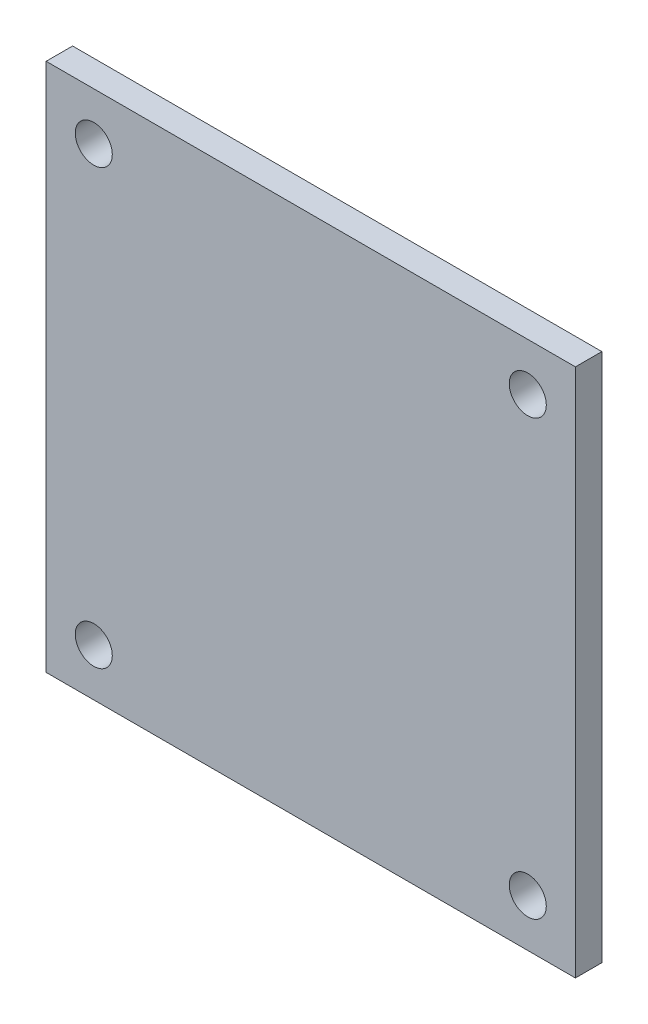
ISO-10303-21;
HEADER;
FILE_DESCRIPTION(('STEP AP214'),'2;1');
FILE_NAME('part.step','',(''),(''),'','','');
FILE_SCHEMA(('AUTOMOTIVE_DESIGN { 1 0 10303 214 1 1 1 1 }'));
ENDSEC;
DATA;
#1=APPLICATION_CONTEXT('core data for automotive mechanical design processes');
#2=APPLICATION_PROTOCOL_DEFINITION('international standard','automotive_design',2000,#1);
#3=PRODUCT_CONTEXT('',#1,'mechanical');
#4=PRODUCT('Part','Part','',(#3));
#5=PRODUCT_RELATED_PRODUCT_CATEGORY('part','',(#4));
#6=PRODUCT_DEFINITION_FORMATION('','',#4);
#7=PRODUCT_DEFINITION_CONTEXT('part definition',#1,'design');
#8=PRODUCT_DEFINITION('design','',#6,#7);
#9=PRODUCT_DEFINITION_SHAPE('','',#8);
#10=(LENGTH_UNIT() NAMED_UNIT(*) SI_UNIT(.MILLI.,.METRE.));
#11=(NAMED_UNIT(*) PLANE_ANGLE_UNIT() SI_UNIT($,.RADIAN.));
#12=(NAMED_UNIT(*) SI_UNIT($,.STERADIAN.) SOLID_ANGLE_UNIT());
#13=UNCERTAINTY_MEASURE_WITH_UNIT(LENGTH_MEASURE(1.E-05),#10,'distance_accuracy_value','');
#14=(GEOMETRIC_REPRESENTATION_CONTEXT(3) GLOBAL_UNCERTAINTY_ASSIGNED_CONTEXT((#13)) GLOBAL_UNIT_ASSIGNED_CONTEXT((#10,
#11,#12)) REPRESENTATION_CONTEXT('',''));
#15=CARTESIAN_POINT('',(0.,0.,0.));
#16=DIRECTION('',(0.,0.,1.));
#17=DIRECTION('',(1.,0.,0.));
#18=AXIS2_PLACEMENT_3D('',#15,#16,#17);
#19=CARTESIAN_POINT('',(50.,-50.,5.));
#20=DIRECTION('',(-1.,0.,0.));
#21=DIRECTION('',(0.,0.,1.));
#22=AXIS2_PLACEMENT_3D('',#19,#20,#21);
#23=PLANE('',#22);
#24=DIRECTION('',(0.,1.,0.));
#25=VECTOR('',#24,1.);
#26=CARTESIAN_POINT('',(50.,-50.,0.));
#27=LINE('',#26,#25);
#28=CARTESIAN_POINT('',(50.,-50.,0.));
#29=VERTEX_POINT('',#28);
#30=CARTESIAN_POINT('',(50.,50.,0.));
#31=VERTEX_POINT('',#30);
#32=EDGE_CURVE('E102',#29,#31,#27,.T.);
#33=ORIENTED_EDGE('',*,*,#32,.T.);
#34=DIRECTION('',(0.,0.,-1.));
#35=VECTOR('',#34,1.);
#36=CARTESIAN_POINT('',(50.,50.,5.));
#37=LINE('',#36,#35);
#38=CARTESIAN_POINT('',(50.,50.,5.));
#39=VERTEX_POINT('',#38);
#40=EDGE_CURVE('E11',#39,#31,#37,.T.);
#41=ORIENTED_EDGE('',*,*,#40,.F.);
#42=DIRECTION('',(0.,1.,0.));
#43=VECTOR('',#42,1.);
#44=CARTESIAN_POINT('',(50.,-50.,5.));
#45=LINE('',#44,#43);
#46=CARTESIAN_POINT('',(50.,-50.,5.));
#47=VERTEX_POINT('',#46);
#48=EDGE_CURVE('E90',#47,#39,#45,.T.);
#49=ORIENTED_EDGE('',*,*,#48,.F.);
#50=DIRECTION('',(0.,0.,-1.));
#51=VECTOR('',#50,1.);
#52=CARTESIAN_POINT('',(50.,-50.,5.));
#53=LINE('',#52,#51);
#54=EDGE_CURVE('E98',#47,#29,#53,.T.);
#55=ORIENTED_EDGE('',*,*,#54,.T.);
#56=EDGE_LOOP('',(#33,#41,#49,#55));
#57=FACE_BOUND('',#56,.T.);
#58=ADVANCED_FACE('F39',(#57),#23,.F.);
#59=CARTESIAN_POINT('',(-50.,50.,5.));
#60=DIRECTION('',(0.,-1.,0.));
#61=DIRECTION('',(0.,0.,-1.));
#62=AXIS2_PLACEMENT_3D('',#59,#60,#61);
#63=PLANE('',#62);
#64=DIRECTION('',(-1.,0.,0.));
#65=VECTOR('',#64,1.);
#66=CARTESIAN_POINT('',(-50.,50.,0.));
#67=LINE('',#66,#65);
#68=CARTESIAN_POINT('',(-50.,50.,0.));
#69=VERTEX_POINT('',#68);
#70=EDGE_CURVE('E94',#31,#69,#67,.T.);
#71=ORIENTED_EDGE('',*,*,#70,.T.);
#72=DIRECTION('',(0.,0.,-1.));
#73=VECTOR('',#72,1.);
#74=CARTESIAN_POINT('',(-50.,50.,5.));
#75=LINE('',#74,#73);
#76=CARTESIAN_POINT('',(-50.,50.,5.));
#77=VERTEX_POINT('',#76);
#78=EDGE_CURVE('E47',#77,#69,#75,.T.);
#79=ORIENTED_EDGE('',*,*,#78,.F.);
#80=DIRECTION('',(-1.,0.,0.));
#81=VECTOR('',#80,1.);
#82=CARTESIAN_POINT('',(-50.,50.,5.));
#83=LINE('',#82,#81);
#84=EDGE_CURVE('E85',#39,#77,#83,.T.);
#85=ORIENTED_EDGE('',*,*,#84,.F.);
#86=ORIENTED_EDGE('',*,*,#40,.T.);
#87=EDGE_LOOP('',(#71,#79,#85,#86));
#88=FACE_BOUND('',#87,.T.);
#89=ADVANCED_FACE('F93',(#88),#63,.F.);
#90=CARTESIAN_POINT('',(-50.,-50.,5.));
#91=DIRECTION('',(1.,0.,0.));
#92=DIRECTION('',(0.,0.,-1.));
#93=AXIS2_PLACEMENT_3D('',#90,#91,#92);
#94=PLANE('',#93);
#95=DIRECTION('',(0.,-1.,0.));
#96=VECTOR('',#95,1.);
#97=CARTESIAN_POINT('',(-50.,-50.,0.));
#98=LINE('',#97,#96);
#99=CARTESIAN_POINT('',(-50.,-50.,0.));
#100=VERTEX_POINT('',#99);
#101=EDGE_CURVE('E72',#69,#100,#98,.T.);
#102=ORIENTED_EDGE('',*,*,#101,.T.);
#103=DIRECTION('',(0.,0.,-1.));
#104=VECTOR('',#103,1.);
#105=CARTESIAN_POINT('',(-50.,-50.,5.));
#106=LINE('',#105,#104);
#107=CARTESIAN_POINT('',(-50.,-50.,5.));
#108=VERTEX_POINT('',#107);
#109=EDGE_CURVE('E95',#108,#100,#106,.T.);
#110=ORIENTED_EDGE('',*,*,#109,.F.);
#111=DIRECTION('',(0.,-1.,0.));
#112=VECTOR('',#111,1.);
#113=CARTESIAN_POINT('',(-50.,-50.,5.));
#114=LINE('',#113,#112);
#115=EDGE_CURVE('E88',#77,#108,#114,.T.);
#116=ORIENTED_EDGE('',*,*,#115,.F.);
#117=ORIENTED_EDGE('',*,*,#78,.T.);
#118=EDGE_LOOP('',(#102,#110,#116,#117));
#119=FACE_BOUND('',#118,.T.);
#120=ADVANCED_FACE('F96',(#119),#94,.F.);
#121=CARTESIAN_POINT('',(-50.,-50.,5.));
#122=DIRECTION('',(0.,1.,0.));
#123=DIRECTION('',(0.,0.,1.));
#124=AXIS2_PLACEMENT_3D('',#121,#122,#123);
#125=PLANE('',#124);
#126=DIRECTION('',(1.,0.,0.));
#127=VECTOR('',#126,1.);
#128=CARTESIAN_POINT('',(-50.,-50.,0.));
#129=LINE('',#128,#127);
#130=EDGE_CURVE('E78',#100,#29,#129,.T.);
#131=ORIENTED_EDGE('',*,*,#130,.T.);
#132=ORIENTED_EDGE('',*,*,#54,.F.);
#133=DIRECTION('',(1.,0.,0.));
#134=VECTOR('',#133,1.);
#135=CARTESIAN_POINT('',(-50.,-50.,5.));
#136=LINE('',#135,#134);
#137=EDGE_CURVE('E55',#108,#47,#136,.T.);
#138=ORIENTED_EDGE('',*,*,#137,.F.);
#139=ORIENTED_EDGE('',*,*,#109,.T.);
#140=EDGE_LOOP('',(#131,#132,#138,#139));
#141=FACE_BOUND('',#140,.T.);
#142=ADVANCED_FACE('F110',(#141),#125,.F.);
#143=CARTESIAN_POINT('',(0.,0.,5.));
#144=DIRECTION('',(0.,0.,-1.));
#145=DIRECTION('',(-1.,0.,0.));
#146=AXIS2_PLACEMENT_3D('',#143,#144,#145);
#147=PLANE('',#146);
#148=CARTESIAN_POINT('',(41.,41.,5.));
#149=DIRECTION('',(0.,0.,1.));
#150=DIRECTION('',(1.,0.,0.));
#151=AXIS2_PLACEMENT_3D('',#148,#149,#150);
#152=CIRCLE('',#151,3.50000000000001);
#153=CARTESIAN_POINT('',(44.5,41.,5.));
#154=VERTEX_POINT('',#153);
#155=EDGE_CURVE('E122',#154,#154,#152,.T.);
#156=ORIENTED_EDGE('',*,*,#155,.F.);
#157=EDGE_LOOP('',(#156));
#158=FACE_BOUND('',#157,.T.);
#159=CARTESIAN_POINT('',(41.,-41.,5.));
#160=DIRECTION('',(0.,0.,1.));
#161=DIRECTION('',(1.,0.,0.));
#162=AXIS2_PLACEMENT_3D('',#159,#160,#161);
#163=CIRCLE('',#162,3.50000000000001);
#164=CARTESIAN_POINT('',(44.5,-41.,5.));
#165=VERTEX_POINT('',#164);
#166=EDGE_CURVE('E129',#165,#165,#163,.T.);
#167=ORIENTED_EDGE('',*,*,#166,.F.);
#168=EDGE_LOOP('',(#167));
#169=FACE_BOUND('',#168,.T.);
#170=CARTESIAN_POINT('',(-41.,-41.,5.));
#171=DIRECTION('',(0.,0.,1.));
#172=DIRECTION('',(1.,0.,0.));
#173=AXIS2_PLACEMENT_3D('',#170,#171,#172);
#174=CIRCLE('',#173,3.5);
#175=CARTESIAN_POINT('',(-37.5,-41.,5.));
#176=VERTEX_POINT('',#175);
#177=EDGE_CURVE('E121',#176,#176,#174,.T.);
#178=ORIENTED_EDGE('',*,*,#177,.F.);
#179=EDGE_LOOP('',(#178));
#180=FACE_BOUND('',#179,.T.);
#181=CARTESIAN_POINT('',(-41.,41.,5.));
#182=DIRECTION('',(0.,0.,1.));
#183=DIRECTION('',(1.,0.,0.));
#184=AXIS2_PLACEMENT_3D('',#181,#182,#183);
#185=CIRCLE('',#184,3.5);
#186=CARTESIAN_POINT('',(-37.5,41.,5.));
#187=VERTEX_POINT('',#186);
#188=EDGE_CURVE('E118',#187,#187,#185,.T.);
#189=ORIENTED_EDGE('',*,*,#188,.F.);
#190=EDGE_LOOP('',(#189));
#191=FACE_BOUND('',#190,.T.);
#192=ORIENTED_EDGE('',*,*,#48,.T.);
#193=ORIENTED_EDGE('',*,*,#84,.T.);
#194=ORIENTED_EDGE('',*,*,#115,.T.);
#195=ORIENTED_EDGE('',*,*,#137,.T.);
#196=EDGE_LOOP('',(#192,#193,#194,#195));
#197=FACE_BOUND('',#196,.T.);
#198=ADVANCED_FACE('F86',(#158,#169,#180,#191,#197),#147,.F.);
#199=CARTESIAN_POINT('',(0.,0.,0.));
#200=DIRECTION('',(0.,0.,-1.));
#201=DIRECTION('',(-1.,0.,0.));
#202=AXIS2_PLACEMENT_3D('',#199,#200,#201);
#203=PLANE('',#202);
#204=CARTESIAN_POINT('',(41.,41.,0.));
#205=DIRECTION('',(0.,0.,-1.));
#206=DIRECTION('',(-1.,0.,0.));
#207=AXIS2_PLACEMENT_3D('',#204,#205,#206);
#208=CIRCLE('',#207,3.50000000000001);
#209=CARTESIAN_POINT('',(44.5,41.,0.));
#210=VERTEX_POINT('',#209);
#211=EDGE_CURVE('E126',#210,#210,#208,.F.);
#212=ORIENTED_EDGE('',*,*,#211,.T.);
#213=EDGE_LOOP('',(#212));
#214=FACE_BOUND('',#213,.T.);
#215=CARTESIAN_POINT('',(41.,-41.,0.));
#216=DIRECTION('',(0.,0.,-1.));
#217=DIRECTION('',(-1.,0.,0.));
#218=AXIS2_PLACEMENT_3D('',#215,#216,#217);
#219=CIRCLE('',#218,3.50000000000001);
#220=CARTESIAN_POINT('',(44.5,-41.,0.));
#221=VERTEX_POINT('',#220);
#222=EDGE_CURVE('E125',#221,#221,#219,.F.);
#223=ORIENTED_EDGE('',*,*,#222,.T.);
#224=EDGE_LOOP('',(#223));
#225=FACE_BOUND('',#224,.T.);
#226=CARTESIAN_POINT('',(-41.,-41.,0.));
#227=DIRECTION('',(0.,0.,-1.));
#228=DIRECTION('',(-1.,0.,0.));
#229=AXIS2_PLACEMENT_3D('',#226,#227,#228);
#230=CIRCLE('',#229,3.5);
#231=CARTESIAN_POINT('',(-37.5,-41.,0.));
#232=VERTEX_POINT('',#231);
#233=EDGE_CURVE('E132',#232,#232,#230,.F.);
#234=ORIENTED_EDGE('',*,*,#233,.T.);
#235=EDGE_LOOP('',(#234));
#236=FACE_BOUND('',#235,.T.);
#237=CARTESIAN_POINT('',(-41.,41.,0.));
#238=DIRECTION('',(0.,0.,-1.));
#239=DIRECTION('',(-1.,0.,0.));
#240=AXIS2_PLACEMENT_3D('',#237,#238,#239);
#241=CIRCLE('',#240,3.5);
#242=CARTESIAN_POINT('',(-37.5,41.,0.));
#243=VERTEX_POINT('',#242);
#244=EDGE_CURVE('E105',#243,#243,#241,.F.);
#245=ORIENTED_EDGE('',*,*,#244,.T.);
#246=EDGE_LOOP('',(#245));
#247=FACE_BOUND('',#246,.T.);
#248=ORIENTED_EDGE('',*,*,#32,.F.);
#249=ORIENTED_EDGE('',*,*,#130,.F.);
#250=ORIENTED_EDGE('',*,*,#101,.F.);
#251=ORIENTED_EDGE('',*,*,#70,.F.);
#252=EDGE_LOOP('',(#248,#249,#250,#251));
#253=FACE_BOUND('',#252,.T.);
#254=ADVANCED_FACE('F113',(#214,#225,#236,#247,#253),#203,.T.);
#255=CARTESIAN_POINT('',(-41.,41.,-9.89949493661169));
#256=DIRECTION('',(0.,0.,1.));
#257=DIRECTION('',(1.,0.,0.));
#258=AXIS2_PLACEMENT_3D('',#255,#256,#257);
#259=CYLINDRICAL_SURFACE('',#258,3.5);
#260=CARTESIAN_POINT('',(-37.5,41.,5.));
#261=CARTESIAN_POINT('',(-37.5,41.,4.94791666666667));
#262=CARTESIAN_POINT('',(-37.5,41.,4.89583333333333));
#263=CARTESIAN_POINT('',(-37.5,41.,4.79166666666667));
#264=CARTESIAN_POINT('',(-37.5,41.,4.73958333333333));
#265=CARTESIAN_POINT('',(-37.5,41.,4.63541666666667));
#266=CARTESIAN_POINT('',(-37.5,41.,4.58333333333333));
#267=CARTESIAN_POINT('',(-37.5,41.,4.47916666666667));
#268=CARTESIAN_POINT('',(-37.5,41.,4.42708333333333));
#269=CARTESIAN_POINT('',(-37.5,41.,4.32291666666667));
#270=CARTESIAN_POINT('',(-37.5,41.,4.27083333333333));
#271=CARTESIAN_POINT('',(-37.5,41.,4.16666666666667));
#272=CARTESIAN_POINT('',(-37.5,41.,4.11458333333333));
#273=CARTESIAN_POINT('',(-37.5,41.,4.01041666666667));
#274=CARTESIAN_POINT('',(-37.5,41.,3.95833333333333));
#275=CARTESIAN_POINT('',(-37.5,41.,3.85416666666667));
#276=CARTESIAN_POINT('',(-37.5,41.,3.80208333333333));
#277=CARTESIAN_POINT('',(-37.5,41.,3.69791666666667));
#278=CARTESIAN_POINT('',(-37.5,41.,3.64583333333333));
#279=CARTESIAN_POINT('',(-37.5,41.,3.54166666666667));
#280=CARTESIAN_POINT('',(-37.5,41.,3.48958333333333));
#281=CARTESIAN_POINT('',(-37.5,41.,3.38541666666667));
#282=CARTESIAN_POINT('',(-37.5,41.,3.33333333333333));
#283=CARTESIAN_POINT('',(-37.5,41.,3.22916666666667));
#284=CARTESIAN_POINT('',(-37.5,41.,3.17708333333333));
#285=CARTESIAN_POINT('',(-37.5,41.,3.07291666666667));
#286=CARTESIAN_POINT('',(-37.5,41.,3.02083333333333));
#287=CARTESIAN_POINT('',(-37.5,41.,2.91666666666667));
#288=CARTESIAN_POINT('',(-37.5,41.,2.86458333333333));
#289=CARTESIAN_POINT('',(-37.5,41.,2.76041666666667));
#290=CARTESIAN_POINT('',(-37.5,41.,2.70833333333333));
#291=CARTESIAN_POINT('',(-37.5,41.,2.60416666666667));
#292=CARTESIAN_POINT('',(-37.5,41.,2.55208333333333));
#293=CARTESIAN_POINT('',(-37.5,41.,2.44791666666667));
#294=CARTESIAN_POINT('',(-37.5,41.,2.39583333333333));
#295=CARTESIAN_POINT('',(-37.5,41.,2.29166666666667));
#296=CARTESIAN_POINT('',(-37.5,41.,2.23958333333333));
#297=CARTESIAN_POINT('',(-37.5,41.,2.13541666666667));
#298=CARTESIAN_POINT('',(-37.5,41.,2.08333333333333));
#299=CARTESIAN_POINT('',(-37.5,41.,1.97916666666667));
#300=CARTESIAN_POINT('',(-37.5,41.,1.92708333333333));
#301=CARTESIAN_POINT('',(-37.5,41.,1.82291666666667));
#302=CARTESIAN_POINT('',(-37.5,41.,1.77083333333333));
#303=CARTESIAN_POINT('',(-37.5,41.,1.66666666666667));
#304=CARTESIAN_POINT('',(-37.5,41.,1.61458333333333));
#305=CARTESIAN_POINT('',(-37.5,41.,1.51041666666667));
#306=CARTESIAN_POINT('',(-37.5,41.,1.45833333333333));
#307=CARTESIAN_POINT('',(-37.5,41.,1.35416666666667));
#308=CARTESIAN_POINT('',(-37.5,41.,1.30208333333333));
#309=CARTESIAN_POINT('',(-37.5,41.,1.19791666666667));
#310=CARTESIAN_POINT('',(-37.5,41.,1.14583333333333));
#311=CARTESIAN_POINT('',(-37.5,41.,1.04166666666667));
#312=CARTESIAN_POINT('',(-37.5,41.,0.989583333333334));
#313=CARTESIAN_POINT('',(-37.5,41.,0.885416666666668));
#314=CARTESIAN_POINT('',(-37.5,41.,0.833333333333335));
#315=CARTESIAN_POINT('',(-37.5,41.,0.729166666666669));
#316=CARTESIAN_POINT('',(-37.5,41.,0.677083333333336));
#317=CARTESIAN_POINT('',(-37.5,41.,0.572916666666669));
#318=CARTESIAN_POINT('',(-37.5,41.,0.520833333333335));
#319=CARTESIAN_POINT('',(-37.5,41.,0.416666666666669));
#320=CARTESIAN_POINT('',(-37.5,41.,0.364583333333335));
#321=CARTESIAN_POINT('',(-37.5,41.,0.260416666666669));
#322=CARTESIAN_POINT('',(-37.5,41.,0.208333333333335));
#323=CARTESIAN_POINT('',(-37.5,41.,0.104166666666669));
#324=CARTESIAN_POINT('',(-37.5,41.,0.0520833333333352));
#325=CARTESIAN_POINT('',(-37.5,41.,0.));
#326=B_SPLINE_CURVE_WITH_KNOTS('',3,(#260,#261,#262,#263,#264,#265,#266,#267,#268,#269,#270,
#271,#272,#273,#274,#275,#276,#277,#278,#279,#280,#281,#282,#283,#284,#285,#286,#287,#288,#289,
#290,#291,#292,#293,#294,#295,#296,#297,#298,#299,#300,#301,#302,#303,#304,#305,#306,#307,#308,
#309,#310,#311,#312,#313,#314,#315,#316,#317,#318,#319,#320,#321,#322,#323,#324,#325),
.UNSPECIFIED.,.F.,.F.,(4,2,2,2,2,2,2,2,2,2,2,2,2,2,2,2,2,2,2,2,2,2,2,2,2,2,2,2,2,2,2,2,4),(0.,
0.15625,0.3125,0.46875,0.625000000000001,0.781249999999999,0.937499999999999,1.09375,1.25,
1.40625,1.5625,1.71875,1.875,2.03125,2.1875,2.34375,2.5,2.65625,2.8125,2.96875,3.125,3.28125,
3.4375,3.59375,3.75,3.90625,4.0625,4.21875,4.375,4.53125,4.6875,4.84375,5.),.UNSPECIFIED.);
#327=EDGE_CURVE('BSEAM145',#187,#243,#326,.T.);
#328=ORIENTED_EDGE('',*,*,#188,.T.);
#329=ORIENTED_EDGE('',*,*,#244,.F.);
#330=ORIENTED_EDGE('',*,*,#327,.T.);
#331=ORIENTED_EDGE('',*,*,#327,.F.);
#332=EDGE_LOOP('',(#328,#330,#329,#331));
#333=FACE_BOUND('',#332,.T.);
#334=ADVANCED_FACE('F145',(#333),#259,.F.);
#335=CARTESIAN_POINT('',(-41.,-41.,-9.89949493661169));
#336=DIRECTION('',(0.,0.,1.));
#337=DIRECTION('',(1.,0.,0.));
#338=AXIS2_PLACEMENT_3D('',#335,#336,#337);
#339=CYLINDRICAL_SURFACE('',#338,3.5);
#340=CARTESIAN_POINT('',(-37.5,-41.,5.));
#341=CARTESIAN_POINT('',(-37.5,-41.,4.94791666666667));
#342=CARTESIAN_POINT('',(-37.5,-41.,4.89583333333333));
#343=CARTESIAN_POINT('',(-37.5,-41.,4.79166666666667));
#344=CARTESIAN_POINT('',(-37.5,-41.,4.73958333333333));
#345=CARTESIAN_POINT('',(-37.5,-41.,4.63541666666667));
#346=CARTESIAN_POINT('',(-37.5,-41.,4.58333333333333));
#347=CARTESIAN_POINT('',(-37.5,-41.,4.47916666666667));
#348=CARTESIAN_POINT('',(-37.5,-41.,4.42708333333333));
#349=CARTESIAN_POINT('',(-37.5,-41.,4.32291666666667));
#350=CARTESIAN_POINT('',(-37.5,-41.,4.27083333333333));
#351=CARTESIAN_POINT('',(-37.5,-41.,4.16666666666667));
#352=CARTESIAN_POINT('',(-37.5,-41.,4.11458333333333));
#353=CARTESIAN_POINT('',(-37.5,-41.,4.01041666666667));
#354=CARTESIAN_POINT('',(-37.5,-41.,3.95833333333333));
#355=CARTESIAN_POINT('',(-37.5,-41.,3.85416666666667));
#356=CARTESIAN_POINT('',(-37.5,-41.,3.80208333333333));
#357=CARTESIAN_POINT('',(-37.5,-41.,3.69791666666667));
#358=CARTESIAN_POINT('',(-37.5,-41.,3.64583333333333));
#359=CARTESIAN_POINT('',(-37.5,-41.,3.54166666666667));
#360=CARTESIAN_POINT('',(-37.5,-41.,3.48958333333333));
#361=CARTESIAN_POINT('',(-37.5,-41.,3.38541666666667));
#362=CARTESIAN_POINT('',(-37.5,-41.,3.33333333333333));
#363=CARTESIAN_POINT('',(-37.5,-41.,3.22916666666667));
#364=CARTESIAN_POINT('',(-37.5,-41.,3.17708333333333));
#365=CARTESIAN_POINT('',(-37.5,-41.,3.07291666666667));
#366=CARTESIAN_POINT('',(-37.5,-41.,3.02083333333333));
#367=CARTESIAN_POINT('',(-37.5,-41.,2.91666666666667));
#368=CARTESIAN_POINT('',(-37.5,-41.,2.86458333333333));
#369=CARTESIAN_POINT('',(-37.5,-41.,2.76041666666667));
#370=CARTESIAN_POINT('',(-37.5,-41.,2.70833333333333));
#371=CARTESIAN_POINT('',(-37.5,-41.,2.60416666666667));
#372=CARTESIAN_POINT('',(-37.5,-41.,2.55208333333333));
#373=CARTESIAN_POINT('',(-37.5,-41.,2.44791666666667));
#374=CARTESIAN_POINT('',(-37.5,-41.,2.39583333333333));
#375=CARTESIAN_POINT('',(-37.5,-41.,2.29166666666667));
#376=CARTESIAN_POINT('',(-37.5,-41.,2.23958333333333));
#377=CARTESIAN_POINT('',(-37.5,-41.,2.13541666666667));
#378=CARTESIAN_POINT('',(-37.5,-41.,2.08333333333333));
#379=CARTESIAN_POINT('',(-37.5,-41.,1.97916666666667));
#380=CARTESIAN_POINT('',(-37.5,-41.,1.92708333333333));
#381=CARTESIAN_POINT('',(-37.5,-41.,1.82291666666667));
#382=CARTESIAN_POINT('',(-37.5,-41.,1.77083333333333));
#383=CARTESIAN_POINT('',(-37.5,-41.,1.66666666666667));
#384=CARTESIAN_POINT('',(-37.5,-41.,1.61458333333333));
#385=CARTESIAN_POINT('',(-37.5,-41.,1.51041666666667));
#386=CARTESIAN_POINT('',(-37.5,-41.,1.45833333333333));
#387=CARTESIAN_POINT('',(-37.5,-41.,1.35416666666667));
#388=CARTESIAN_POINT('',(-37.5,-41.,1.30208333333333));
#389=CARTESIAN_POINT('',(-37.5,-41.,1.19791666666667));
#390=CARTESIAN_POINT('',(-37.5,-41.,1.14583333333333));
#391=CARTESIAN_POINT('',(-37.5,-41.,1.04166666666667));
#392=CARTESIAN_POINT('',(-37.5,-41.,0.989583333333334));
#393=CARTESIAN_POINT('',(-37.5,-41.,0.885416666666668));
#394=CARTESIAN_POINT('',(-37.5,-41.,0.833333333333335));
#395=CARTESIAN_POINT('',(-37.5,-41.,0.729166666666669));
#396=CARTESIAN_POINT('',(-37.5,-41.,0.677083333333336));
#397=CARTESIAN_POINT('',(-37.5,-41.,0.572916666666669));
#398=CARTESIAN_POINT('',(-37.5,-41.,0.520833333333335));
#399=CARTESIAN_POINT('',(-37.5,-41.,0.416666666666669));
#400=CARTESIAN_POINT('',(-37.5,-41.,0.364583333333335));
#401=CARTESIAN_POINT('',(-37.5,-41.,0.260416666666669));
#402=CARTESIAN_POINT('',(-37.5,-41.,0.208333333333335));
#403=CARTESIAN_POINT('',(-37.5,-41.,0.104166666666669));
#404=CARTESIAN_POINT('',(-37.5,-41.,0.0520833333333352));
#405=CARTESIAN_POINT('',(-37.5,-41.,0.));
#406=B_SPLINE_CURVE_WITH_KNOTS('',3,(#340,#341,#342,#343,#344,#345,#346,#347,#348,#349,#350,
#351,#352,#353,#354,#355,#356,#357,#358,#359,#360,#361,#362,#363,#364,#365,#366,#367,#368,#369,
#370,#371,#372,#373,#374,#375,#376,#377,#378,#379,#380,#381,#382,#383,#384,#385,#386,#387,#388,
#389,#390,#391,#392,#393,#394,#395,#396,#397,#398,#399,#400,#401,#402,#403,#404,#405),
.UNSPECIFIED.,.F.,.F.,(4,2,2,2,2,2,2,2,2,2,2,2,2,2,2,2,2,2,2,2,2,2,2,2,2,2,2,2,2,2,2,2,4),(0.,
0.15625,0.3125,0.46875,0.625000000000001,0.781249999999999,0.937499999999999,1.09375,1.25,
1.40625,1.5625,1.71875,1.875,2.03125,2.1875,2.34375,2.5,2.65625,2.8125,2.96875,3.125,3.28125,
3.4375,3.59375,3.75,3.90625,4.0625,4.21875,4.375,4.53125,4.6875,4.84375,5.),.UNSPECIFIED.);
#407=EDGE_CURVE('BSEAM142',#176,#232,#406,.T.);
#408=ORIENTED_EDGE('',*,*,#177,.T.);
#409=ORIENTED_EDGE('',*,*,#233,.F.);
#410=ORIENTED_EDGE('',*,*,#407,.T.);
#411=ORIENTED_EDGE('',*,*,#407,.F.);
#412=EDGE_LOOP('',(#408,#410,#409,#411));
#413=FACE_BOUND('',#412,.T.);
#414=ADVANCED_FACE('F142',(#413),#339,.F.);
#415=CARTESIAN_POINT('',(41.,-41.,-9.89949493661169));
#416=DIRECTION('',(0.,0.,1.));
#417=DIRECTION('',(1.,0.,0.));
#418=AXIS2_PLACEMENT_3D('',#415,#416,#417);
#419=CYLINDRICAL_SURFACE('',#418,3.50000000000001);
#420=CARTESIAN_POINT('',(44.5,-41.,5.));
#421=CARTESIAN_POINT('',(44.5,-41.,4.94791666666667));
#422=CARTESIAN_POINT('',(44.5,-41.,4.89583333333333));
#423=CARTESIAN_POINT('',(44.5,-41.,4.79166666666667));
#424=CARTESIAN_POINT('',(44.5,-41.,4.73958333333333));
#425=CARTESIAN_POINT('',(44.5,-41.,4.63541666666667));
#426=CARTESIAN_POINT('',(44.5,-41.,4.58333333333333));
#427=CARTESIAN_POINT('',(44.5,-41.,4.47916666666667));
#428=CARTESIAN_POINT('',(44.5,-41.,4.42708333333333));
#429=CARTESIAN_POINT('',(44.5,-41.,4.32291666666667));
#430=CARTESIAN_POINT('',(44.5,-41.,4.27083333333333));
#431=CARTESIAN_POINT('',(44.5,-41.,4.16666666666667));
#432=CARTESIAN_POINT('',(44.5,-41.,4.11458333333333));
#433=CARTESIAN_POINT('',(44.5,-41.,4.01041666666667));
#434=CARTESIAN_POINT('',(44.5,-41.,3.95833333333333));
#435=CARTESIAN_POINT('',(44.5,-41.,3.85416666666667));
#436=CARTESIAN_POINT('',(44.5,-41.,3.80208333333333));
#437=CARTESIAN_POINT('',(44.5,-41.,3.69791666666667));
#438=CARTESIAN_POINT('',(44.5,-41.,3.64583333333333));
#439=CARTESIAN_POINT('',(44.5,-41.,3.54166666666667));
#440=CARTESIAN_POINT('',(44.5,-41.,3.48958333333333));
#441=CARTESIAN_POINT('',(44.5,-41.,3.38541666666667));
#442=CARTESIAN_POINT('',(44.5,-41.,3.33333333333333));
#443=CARTESIAN_POINT('',(44.5,-41.,3.22916666666667));
#444=CARTESIAN_POINT('',(44.5,-41.,3.17708333333333));
#445=CARTESIAN_POINT('',(44.5,-41.,3.07291666666667));
#446=CARTESIAN_POINT('',(44.5,-41.,3.02083333333333));
#447=CARTESIAN_POINT('',(44.5,-41.,2.91666666666667));
#448=CARTESIAN_POINT('',(44.5,-41.,2.86458333333333));
#449=CARTESIAN_POINT('',(44.5,-41.,2.76041666666667));
#450=CARTESIAN_POINT('',(44.5,-41.,2.70833333333333));
#451=CARTESIAN_POINT('',(44.5,-41.,2.60416666666667));
#452=CARTESIAN_POINT('',(44.5,-41.,2.55208333333333));
#453=CARTESIAN_POINT('',(44.5,-41.,2.44791666666667));
#454=CARTESIAN_POINT('',(44.5,-41.,2.39583333333333));
#455=CARTESIAN_POINT('',(44.5,-41.,2.29166666666667));
#456=CARTESIAN_POINT('',(44.5,-41.,2.23958333333333));
#457=CARTESIAN_POINT('',(44.5,-41.,2.13541666666667));
#458=CARTESIAN_POINT('',(44.5,-41.,2.08333333333333));
#459=CARTESIAN_POINT('',(44.5,-41.,1.97916666666667));
#460=CARTESIAN_POINT('',(44.5,-41.,1.92708333333333));
#461=CARTESIAN_POINT('',(44.5,-41.,1.82291666666667));
#462=CARTESIAN_POINT('',(44.5,-41.,1.77083333333333));
#463=CARTESIAN_POINT('',(44.5,-41.,1.66666666666667));
#464=CARTESIAN_POINT('',(44.5,-41.,1.61458333333333));
#465=CARTESIAN_POINT('',(44.5,-41.,1.51041666666667));
#466=CARTESIAN_POINT('',(44.5,-41.,1.45833333333333));
#467=CARTESIAN_POINT('',(44.5,-41.,1.35416666666667));
#468=CARTESIAN_POINT('',(44.5,-41.,1.30208333333333));
#469=CARTESIAN_POINT('',(44.5,-41.,1.19791666666667));
#470=CARTESIAN_POINT('',(44.5,-41.,1.14583333333333));
#471=CARTESIAN_POINT('',(44.5,-41.,1.04166666666667));
#472=CARTESIAN_POINT('',(44.5,-41.,0.989583333333334));
#473=CARTESIAN_POINT('',(44.5,-41.,0.885416666666668));
#474=CARTESIAN_POINT('',(44.5,-41.,0.833333333333335));
#475=CARTESIAN_POINT('',(44.5,-41.,0.729166666666669));
#476=CARTESIAN_POINT('',(44.5,-41.,0.677083333333336));
#477=CARTESIAN_POINT('',(44.5,-41.,0.572916666666669));
#478=CARTESIAN_POINT('',(44.5,-41.,0.520833333333335));
#479=CARTESIAN_POINT('',(44.5,-41.,0.416666666666669));
#480=CARTESIAN_POINT('',(44.5,-41.,0.364583333333335));
#481=CARTESIAN_POINT('',(44.5,-41.,0.260416666666669));
#482=CARTESIAN_POINT('',(44.5,-41.,0.208333333333335));
#483=CARTESIAN_POINT('',(44.5,-41.,0.104166666666669));
#484=CARTESIAN_POINT('',(44.5,-41.,0.0520833333333352));
#485=CARTESIAN_POINT('',(44.5,-41.,0.));
#486=B_SPLINE_CURVE_WITH_KNOTS('',3,(#420,#421,#422,#423,#424,#425,#426,#427,#428,#429,#430,
#431,#432,#433,#434,#435,#436,#437,#438,#439,#440,#441,#442,#443,#444,#445,#446,#447,#448,#449,
#450,#451,#452,#453,#454,#455,#456,#457,#458,#459,#460,#461,#462,#463,#464,#465,#466,#467,#468,
#469,#470,#471,#472,#473,#474,#475,#476,#477,#478,#479,#480,#481,#482,#483,#484,#485),
.UNSPECIFIED.,.F.,.F.,(4,2,2,2,2,2,2,2,2,2,2,2,2,2,2,2,2,2,2,2,2,2,2,2,2,2,2,2,2,2,2,2,4),(0.,
0.15625,0.3125,0.46875,0.625000000000001,0.781249999999999,0.937499999999999,1.09375,1.25,
1.40625,1.5625,1.71875,1.875,2.03125,2.1875,2.34375,2.5,2.65625,2.8125,2.96875,3.125,3.28125,
3.4375,3.59375,3.75,3.90625,4.0625,4.21875,4.375,4.53125,4.6875,4.84375,5.),.UNSPECIFIED.);
#487=EDGE_CURVE('BSEAM144',#165,#221,#486,.T.);
#488=ORIENTED_EDGE('',*,*,#166,.T.);
#489=ORIENTED_EDGE('',*,*,#222,.F.);
#490=ORIENTED_EDGE('',*,*,#487,.T.);
#491=ORIENTED_EDGE('',*,*,#487,.F.);
#492=EDGE_LOOP('',(#488,#490,#489,#491));
#493=FACE_BOUND('',#492,.T.);
#494=ADVANCED_FACE('F144',(#493),#419,.F.);
#495=CARTESIAN_POINT('',(41.,41.,-9.89949493661169));
#496=DIRECTION('',(0.,0.,1.));
#497=DIRECTION('',(1.,0.,0.));
#498=AXIS2_PLACEMENT_3D('',#495,#496,#497);
#499=CYLINDRICAL_SURFACE('',#498,3.50000000000001);
#500=CARTESIAN_POINT('',(44.5,41.,5.));
#501=CARTESIAN_POINT('',(44.5,41.,4.94791666666667));
#502=CARTESIAN_POINT('',(44.5,41.,4.89583333333333));
#503=CARTESIAN_POINT('',(44.5,41.,4.79166666666667));
#504=CARTESIAN_POINT('',(44.5,41.,4.73958333333333));
#505=CARTESIAN_POINT('',(44.5,41.,4.63541666666667));
#506=CARTESIAN_POINT('',(44.5,41.,4.58333333333333));
#507=CARTESIAN_POINT('',(44.5,41.,4.47916666666667));
#508=CARTESIAN_POINT('',(44.5,41.,4.42708333333333));
#509=CARTESIAN_POINT('',(44.5,41.,4.32291666666667));
#510=CARTESIAN_POINT('',(44.5,41.,4.27083333333333));
#511=CARTESIAN_POINT('',(44.5,41.,4.16666666666667));
#512=CARTESIAN_POINT('',(44.5,41.,4.11458333333333));
#513=CARTESIAN_POINT('',(44.5,41.,4.01041666666667));
#514=CARTESIAN_POINT('',(44.5,41.,3.95833333333333));
#515=CARTESIAN_POINT('',(44.5,41.,3.85416666666667));
#516=CARTESIAN_POINT('',(44.5,41.,3.80208333333333));
#517=CARTESIAN_POINT('',(44.5,41.,3.69791666666667));
#518=CARTESIAN_POINT('',(44.5,41.,3.64583333333333));
#519=CARTESIAN_POINT('',(44.5,41.,3.54166666666667));
#520=CARTESIAN_POINT('',(44.5,41.,3.48958333333333));
#521=CARTESIAN_POINT('',(44.5,41.,3.38541666666667));
#522=CARTESIAN_POINT('',(44.5,41.,3.33333333333333));
#523=CARTESIAN_POINT('',(44.5,41.,3.22916666666667));
#524=CARTESIAN_POINT('',(44.5,41.,3.17708333333333));
#525=CARTESIAN_POINT('',(44.5,41.,3.07291666666667));
#526=CARTESIAN_POINT('',(44.5,41.,3.02083333333333));
#527=CARTESIAN_POINT('',(44.5,41.,2.91666666666667));
#528=CARTESIAN_POINT('',(44.5,41.,2.86458333333333));
#529=CARTESIAN_POINT('',(44.5,41.,2.76041666666667));
#530=CARTESIAN_POINT('',(44.5,41.,2.70833333333333));
#531=CARTESIAN_POINT('',(44.5,41.,2.60416666666667));
#532=CARTESIAN_POINT('',(44.5,41.,2.55208333333333));
#533=CARTESIAN_POINT('',(44.5,41.,2.44791666666667));
#534=CARTESIAN_POINT('',(44.5,41.,2.39583333333333));
#535=CARTESIAN_POINT('',(44.5,41.,2.29166666666667));
#536=CARTESIAN_POINT('',(44.5,41.,2.23958333333333));
#537=CARTESIAN_POINT('',(44.5,41.,2.13541666666667));
#538=CARTESIAN_POINT('',(44.5,41.,2.08333333333333));
#539=CARTESIAN_POINT('',(44.5,41.,1.97916666666667));
#540=CARTESIAN_POINT('',(44.5,41.,1.92708333333333));
#541=CARTESIAN_POINT('',(44.5,41.,1.82291666666667));
#542=CARTESIAN_POINT('',(44.5,41.,1.77083333333333));
#543=CARTESIAN_POINT('',(44.5,41.,1.66666666666667));
#544=CARTESIAN_POINT('',(44.5,41.,1.61458333333333));
#545=CARTESIAN_POINT('',(44.5,41.,1.51041666666667));
#546=CARTESIAN_POINT('',(44.5,41.,1.45833333333333));
#547=CARTESIAN_POINT('',(44.5,41.,1.35416666666667));
#548=CARTESIAN_POINT('',(44.5,41.,1.30208333333333));
#549=CARTESIAN_POINT('',(44.5,41.,1.19791666666667));
#550=CARTESIAN_POINT('',(44.5,41.,1.14583333333333));
#551=CARTESIAN_POINT('',(44.5,41.,1.04166666666667));
#552=CARTESIAN_POINT('',(44.5,41.,0.989583333333334));
#553=CARTESIAN_POINT('',(44.5,41.,0.885416666666668));
#554=CARTESIAN_POINT('',(44.5,41.,0.833333333333335));
#555=CARTESIAN_POINT('',(44.5,41.,0.729166666666669));
#556=CARTESIAN_POINT('',(44.5,41.,0.677083333333336));
#557=CARTESIAN_POINT('',(44.5,41.,0.572916666666669));
#558=CARTESIAN_POINT('',(44.5,41.,0.520833333333335));
#559=CARTESIAN_POINT('',(44.5,41.,0.416666666666669));
#560=CARTESIAN_POINT('',(44.5,41.,0.364583333333335));
#561=CARTESIAN_POINT('',(44.5,41.,0.260416666666669));
#562=CARTESIAN_POINT('',(44.5,41.,0.208333333333335));
#563=CARTESIAN_POINT('',(44.5,41.,0.104166666666669));
#564=CARTESIAN_POINT('',(44.5,41.,0.0520833333333352));
#565=CARTESIAN_POINT('',(44.5,41.,0.));
#566=B_SPLINE_CURVE_WITH_KNOTS('',3,(#500,#501,#502,#503,#504,#505,#506,#507,#508,#509,#510,
#511,#512,#513,#514,#515,#516,#517,#518,#519,#520,#521,#522,#523,#524,#525,#526,#527,#528,#529,
#530,#531,#532,#533,#534,#535,#536,#537,#538,#539,#540,#541,#542,#543,#544,#545,#546,#547,#548,
#549,#550,#551,#552,#553,#554,#555,#556,#557,#558,#559,#560,#561,#562,#563,#564,#565),
.UNSPECIFIED.,.F.,.F.,(4,2,2,2,2,2,2,2,2,2,2,2,2,2,2,2,2,2,2,2,2,2,2,2,2,2,2,2,2,2,2,2,4),(0.,
0.15625,0.3125,0.46875,0.625000000000001,0.781249999999999,0.937499999999999,1.09375,1.25,
1.40625,1.5625,1.71875,1.875,2.03125,2.1875,2.34375,2.5,2.65625,2.8125,2.96875,3.125,3.28125,
3.4375,3.59375,3.75,3.90625,4.0625,4.21875,4.375,4.53125,4.6875,4.84375,5.),.UNSPECIFIED.);
#567=EDGE_CURVE('BSEAM152',#154,#210,#566,.T.);
#568=ORIENTED_EDGE('',*,*,#155,.T.);
#569=ORIENTED_EDGE('',*,*,#211,.F.);
#570=ORIENTED_EDGE('',*,*,#567,.T.);
#571=ORIENTED_EDGE('',*,*,#567,.F.);
#572=EDGE_LOOP('',(#568,#570,#569,#571));
#573=FACE_BOUND('',#572,.T.);
#574=ADVANCED_FACE('F152',(#573),#499,.F.);
#575=CLOSED_SHELL('',(#58,#89,#120,#142,#198,#254,#334,#414,#494,#574));
#576=MANIFOLD_SOLID_BREP('B2',#575);
#577=ADVANCED_BREP_SHAPE_REPRESENTATION('',(#18,#576),#14);
#578=SHAPE_DEFINITION_REPRESENTATION(#9,#577);
ENDSEC;
END-ISO-10303-21;
